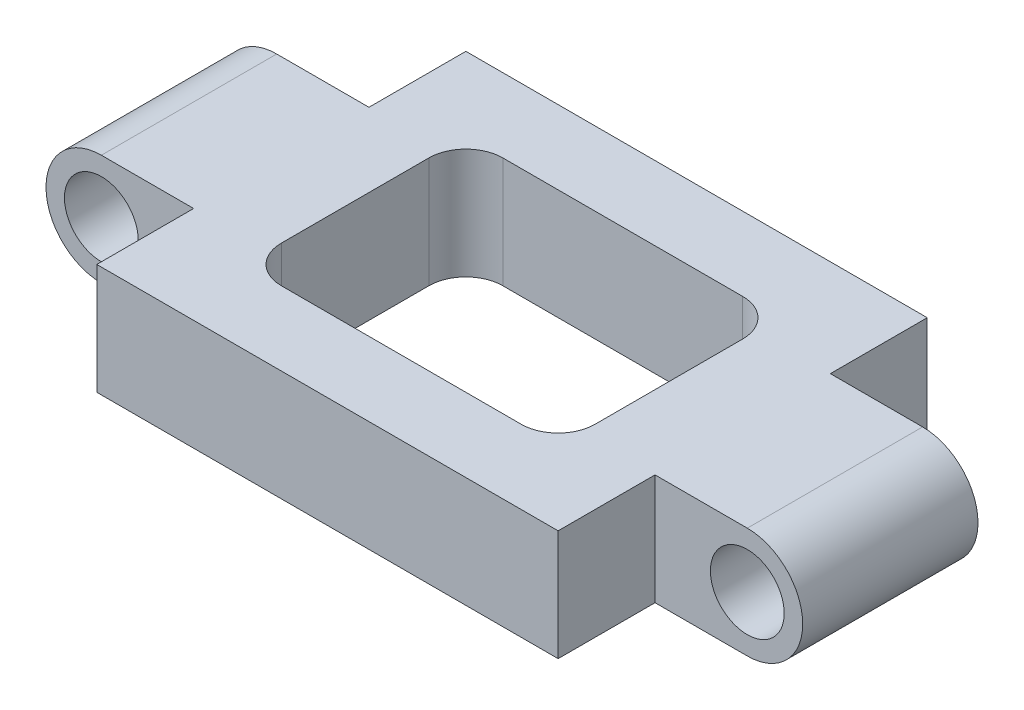
ISO-10303-21;
HEADER;
FILE_DESCRIPTION(('STEP AP214'),'2;1');
FILE_NAME('part.step','',(''),(''),'','','');
FILE_SCHEMA(('AUTOMOTIVE_DESIGN { 1 0 10303 214 1 1 1 1 }'));
ENDSEC;
DATA;
#1=APPLICATION_CONTEXT('core data for automotive mechanical design processes');
#2=APPLICATION_PROTOCOL_DEFINITION('international standard','automotive_design',2000,#1);
#3=PRODUCT_CONTEXT('',#1,'mechanical');
#4=PRODUCT('Part','Part','',(#3));
#5=PRODUCT_RELATED_PRODUCT_CATEGORY('part','',(#4));
#6=PRODUCT_DEFINITION_FORMATION('','',#4);
#7=PRODUCT_DEFINITION_CONTEXT('part definition',#1,'design');
#8=PRODUCT_DEFINITION('design','',#6,#7);
#9=PRODUCT_DEFINITION_SHAPE('','',#8);
#10=(LENGTH_UNIT() NAMED_UNIT(*) SI_UNIT(.MILLI.,.METRE.));
#11=(NAMED_UNIT(*) PLANE_ANGLE_UNIT() SI_UNIT($,.RADIAN.));
#12=(NAMED_UNIT(*) SI_UNIT($,.STERADIAN.) SOLID_ANGLE_UNIT());
#13=UNCERTAINTY_MEASURE_WITH_UNIT(LENGTH_MEASURE(1.E-05),#10,'distance_accuracy_value','');
#14=(GEOMETRIC_REPRESENTATION_CONTEXT(3) GLOBAL_UNCERTAINTY_ASSIGNED_CONTEXT((#13)) GLOBAL_UNIT_ASSIGNED_CONTEXT((#10,
#11,#12)) REPRESENTATION_CONTEXT('',''));
#15=CARTESIAN_POINT('',(0.,0.,0.));
#16=DIRECTION('',(0.,0.,1.));
#17=DIRECTION('',(1.,0.,0.));
#18=AXIS2_PLACEMENT_3D('',#15,#16,#17);
#19=CARTESIAN_POINT('',(17.5,0.,10.));
#20=DIRECTION('',(0.,0.,1.));
#21=DIRECTION('',(1.,0.,0.));
#22=AXIS2_PLACEMENT_3D('',#19,#20,#21);
#23=PLANE('',#22);
#24=DIRECTION('',(0.,1.,0.));
#25=VECTOR('',#24,1.);
#26=CARTESIAN_POINT('',(12.5,-12.5688296045023,10.));
#27=LINE('',#26,#25);
#28=CARTESIAN_POINT('',(12.5,-3.,10.));
#29=VERTEX_POINT('',#28);
#30=CARTESIAN_POINT('',(12.5,3.,10.));
#31=VERTEX_POINT('',#30);
#32=EDGE_CURVE('E190',#29,#31,#27,.T.);
#33=ORIENTED_EDGE('',*,*,#32,.T.);
#34=DIRECTION('',(-1.,0.,0.));
#35=VECTOR('',#34,1.);
#36=CARTESIAN_POINT('',(17.5,3.00000000000001,10.));
#37=LINE('',#36,#35);
#38=CARTESIAN_POINT('',(-12.5,3.,10.));
#39=VERTEX_POINT('',#38);
#40=EDGE_CURVE('E195',#31,#39,#37,.T.);
#41=ORIENTED_EDGE('',*,*,#40,.T.);
#42=DIRECTION('',(0.,1.,0.));
#43=VECTOR('',#42,1.);
#44=CARTESIAN_POINT('',(-12.5,-12.5688296045023,10.));
#45=LINE('',#44,#43);
#46=CARTESIAN_POINT('',(-12.5,-3.,10.));
#47=VERTEX_POINT('',#46);
#48=EDGE_CURVE('E253',#47,#39,#45,.T.);
#49=ORIENTED_EDGE('',*,*,#48,.F.);
#50=DIRECTION('',(1.,0.,0.));
#51=VECTOR('',#50,1.);
#52=CARTESIAN_POINT('',(17.5,-2.99999999999999,10.));
#53=LINE('',#52,#51);
#54=EDGE_CURVE('E263',#47,#29,#53,.T.);
#55=ORIENTED_EDGE('',*,*,#54,.T.);
#56=EDGE_LOOP('',(#33,#41,#49,#55));
#57=FACE_BOUND('',#56,.T.);
#58=ADVANCED_FACE('F34',(#57),#23,.T.);
#59=CARTESIAN_POINT('',(17.5,0.,-10.));
#60=DIRECTION('',(0.,0.,1.));
#61=DIRECTION('',(1.,0.,0.));
#62=AXIS2_PLACEMENT_3D('',#59,#60,#61);
#63=PLANE('',#62);
#64=DIRECTION('',(-1.,0.,0.));
#65=VECTOR('',#64,1.);
#66=CARTESIAN_POINT('',(17.5,3.00000000000001,-10.));
#67=LINE('',#66,#65);
#68=CARTESIAN_POINT('',(12.5,3.,-10.));
#69=VERTEX_POINT('',#68);
#70=CARTESIAN_POINT('',(-12.5,3.,-10.));
#71=VERTEX_POINT('',#70);
#72=EDGE_CURVE('E261',#69,#71,#67,.T.);
#73=ORIENTED_EDGE('',*,*,#72,.F.);
#74=DIRECTION('',(0.,1.,0.));
#75=VECTOR('',#74,1.);
#76=CARTESIAN_POINT('',(12.5,-12.5688296045023,-10.));
#77=LINE('',#76,#75);
#78=CARTESIAN_POINT('',(12.5,-2.99999999999999,-10.));
#79=VERTEX_POINT('',#78);
#80=EDGE_CURVE('E217',#79,#69,#77,.T.);
#81=ORIENTED_EDGE('',*,*,#80,.F.);
#82=DIRECTION('',(1.,0.,0.));
#83=VECTOR('',#82,1.);
#84=CARTESIAN_POINT('',(17.5,-2.99999999999999,-10.));
#85=LINE('',#84,#83);
#86=CARTESIAN_POINT('',(-12.5,-3.,-10.));
#87=VERTEX_POINT('',#86);
#88=EDGE_CURVE('E264',#87,#79,#85,.T.);
#89=ORIENTED_EDGE('',*,*,#88,.F.);
#90=DIRECTION('',(0.,1.,0.));
#91=VECTOR('',#90,1.);
#92=CARTESIAN_POINT('',(-12.5,-12.5688296045023,-10.));
#93=LINE('',#92,#91);
#94=EDGE_CURVE('E228',#87,#71,#93,.T.);
#95=ORIENTED_EDGE('',*,*,#94,.T.);
#96=EDGE_LOOP('',(#73,#81,#89,#95));
#97=FACE_BOUND('',#96,.T.);
#98=ADVANCED_FACE('F378',(#97),#63,.F.);
#99=CARTESIAN_POINT('',(17.5,0.,10.));
#100=DIRECTION('',(0.,0.,-1.));
#101=DIRECTION('',(-1.,0.,0.));
#102=AXIS2_PLACEMENT_3D('',#99,#100,#101);
#103=CYLINDRICAL_SURFACE('',#102,3.);
#104=DIRECTION('',(0.,0.,-1.));
#105=VECTOR('',#104,1.);
#106=CARTESIAN_POINT('',(17.5,3.00000000000001,10.));
#107=LINE('',#106,#105);
#108=CARTESIAN_POINT('',(17.5,3.00000000000001,4.75));
#109=VERTEX_POINT('',#108);
#110=CARTESIAN_POINT('',(17.5,3.00000000000001,-4.75));
#111=VERTEX_POINT('',#110);
#112=EDGE_CURVE('E278',#109,#111,#107,.T.);
#113=ORIENTED_EDGE('',*,*,#112,.F.);
#114=CARTESIAN_POINT('',(17.5,0.,4.75));
#115=DIRECTION('',(0.,0.,-1.));
#116=DIRECTION('',(-1.,0.,0.));
#117=AXIS2_PLACEMENT_3D('',#114,#115,#116);
#118=CIRCLE('',#117,3.);
#119=CARTESIAN_POINT('',(17.5,-2.99999999999999,4.75));
#120=VERTEX_POINT('',#119);
#121=EDGE_CURVE('E177',#109,#120,#118,.T.);
#122=ORIENTED_EDGE('',*,*,#121,.T.);
#123=DIRECTION('',(0.,0.,-1.));
#124=VECTOR('',#123,1.);
#125=CARTESIAN_POINT('',(17.5,-2.99999999999999,10.));
#126=LINE('',#125,#124);
#127=CARTESIAN_POINT('',(17.5,-2.99999999999999,-4.75));
#128=VERTEX_POINT('',#127);
#129=EDGE_CURVE('E267',#120,#128,#126,.T.);
#130=ORIENTED_EDGE('',*,*,#129,.T.);
#131=CARTESIAN_POINT('',(17.5,0.,-4.75));
#132=DIRECTION('',(0.,0.,1.));
#133=DIRECTION('',(1.,0.,0.));
#134=AXIS2_PLACEMENT_3D('',#131,#132,#133);
#135=CIRCLE('',#134,3.);
#136=EDGE_CURVE('E220',#128,#111,#135,.T.);
#137=ORIENTED_EDGE('',*,*,#136,.T.);
#138=EDGE_LOOP('',(#113,#122,#130,#137));
#139=FACE_BOUND('',#138,.T.);
#140=ADVANCED_FACE('F384',(#139),#103,.T.);
#141=CARTESIAN_POINT('',(17.5,3.00000000000001,10.));
#142=DIRECTION('',(0.,-1.,0.));
#143=DIRECTION('',(1.,0.,0.));
#144=AXIS2_PLACEMENT_3D('',#141,#142,#143);
#145=PLANE('',#144);
#146=DIRECTION('',(1.,0.,0.));
#147=VECTOR('',#146,1.);
#148=CARTESIAN_POINT('',(8.5,3.,6.));
#149=LINE('',#148,#147);
#150=CARTESIAN_POINT('',(-6.5,3.,6.));
#151=VERTEX_POINT('',#150);
#152=CARTESIAN_POINT('',(6.5,3.,6.));
#153=VERTEX_POINT('',#152);
#154=EDGE_CURVE('E356',#151,#153,#149,.T.);
#155=ORIENTED_EDGE('',*,*,#154,.F.);
#156=CARTESIAN_POINT('',(-6.5,3.,4.));
#157=DIRECTION('',(0.,-1.,0.));
#158=DIRECTION('',(1.,0.,0.));
#159=AXIS2_PLACEMENT_3D('',#156,#157,#158);
#160=CIRCLE('',#159,2.);
#161=CARTESIAN_POINT('',(-8.5,3.,4.));
#162=VERTEX_POINT('',#161);
#163=EDGE_CURVE('E317',#151,#162,#160,.T.);
#164=ORIENTED_EDGE('',*,*,#163,.T.);
#165=DIRECTION('',(0.,0.,1.));
#166=VECTOR('',#165,1.);
#167=CARTESIAN_POINT('',(-8.5,3.,-6.));
#168=LINE('',#167,#166);
#169=CARTESIAN_POINT('',(-8.5,3.,-4.));
#170=VERTEX_POINT('',#169);
#171=EDGE_CURVE('E332',#170,#162,#168,.T.);
#172=ORIENTED_EDGE('',*,*,#171,.F.);
#173=CARTESIAN_POINT('',(-6.5,3.,-4.));
#174=DIRECTION('',(0.,-1.,0.));
#175=DIRECTION('',(1.,0.,0.));
#176=AXIS2_PLACEMENT_3D('',#173,#174,#175);
#177=CIRCLE('',#176,2.);
#178=CARTESIAN_POINT('',(-6.5,3.,-6.));
#179=VERTEX_POINT('',#178);
#180=EDGE_CURVE('E42',#170,#179,#177,.T.);
#181=ORIENTED_EDGE('',*,*,#180,.T.);
#182=DIRECTION('',(-1.,0.,0.));
#183=VECTOR('',#182,1.);
#184=CARTESIAN_POINT('',(8.5,3.,-6.));
#185=LINE('',#184,#183);
#186=CARTESIAN_POINT('',(6.5,3.,-6.));
#187=VERTEX_POINT('',#186);
#188=EDGE_CURVE('E182',#187,#179,#185,.T.);
#189=ORIENTED_EDGE('',*,*,#188,.F.);
#190=CARTESIAN_POINT('',(6.5,3.,-4.));
#191=DIRECTION('',(0.,-1.,0.));
#192=DIRECTION('',(1.,0.,0.));
#193=AXIS2_PLACEMENT_3D('',#190,#191,#192);
#194=CIRCLE('',#193,2.);
#195=CARTESIAN_POINT('',(8.5,3.,-4.));
#196=VERTEX_POINT('',#195);
#197=EDGE_CURVE('E325',#187,#196,#194,.T.);
#198=ORIENTED_EDGE('',*,*,#197,.T.);
#199=DIRECTION('',(0.,0.,-1.));
#200=VECTOR('',#199,1.);
#201=CARTESIAN_POINT('',(8.5,3.,-6.));
#202=LINE('',#201,#200);
#203=CARTESIAN_POINT('',(8.5,3.,4.));
#204=VERTEX_POINT('',#203);
#205=EDGE_CURVE('E337',#204,#196,#202,.T.);
#206=ORIENTED_EDGE('',*,*,#205,.F.);
#207=CARTESIAN_POINT('',(6.5,3.,4.));
#208=DIRECTION('',(0.,-1.,0.));
#209=DIRECTION('',(1.,0.,0.));
#210=AXIS2_PLACEMENT_3D('',#207,#208,#209);
#211=CIRCLE('',#210,2.);
#212=EDGE_CURVE('E321',#204,#153,#211,.T.);
#213=ORIENTED_EDGE('',*,*,#212,.T.);
#214=EDGE_LOOP('',(#155,#164,#172,#181,#189,#198,#206,#213));
#215=FACE_BOUND('',#214,.T.);
#216=ORIENTED_EDGE('',*,*,#40,.F.);
#217=DIRECTION('',(0.,0.,1.));
#218=VECTOR('',#217,1.);
#219=CARTESIAN_POINT('',(12.5,3.,10.));
#220=LINE('',#219,#218);
#221=CARTESIAN_POINT('',(12.5,3.,4.75));
#222=VERTEX_POINT('',#221);
#223=EDGE_CURVE('E181',#222,#31,#220,.T.);
#224=ORIENTED_EDGE('',*,*,#223,.F.);
#225=DIRECTION('',(-1.,0.,0.));
#226=VECTOR('',#225,1.);
#227=CARTESIAN_POINT('',(20.5,3.00000000000001,4.75));
#228=LINE('',#227,#226);
#229=EDGE_CURVE('E171',#109,#222,#228,.T.);
#230=ORIENTED_EDGE('',*,*,#229,.F.);
#231=ORIENTED_EDGE('',*,*,#112,.T.);
#232=DIRECTION('',(1.,0.,0.));
#233=VECTOR('',#232,1.);
#234=CARTESIAN_POINT('',(20.5,3.00000000000001,-4.75));
#235=LINE('',#234,#233);
#236=CARTESIAN_POINT('',(12.5,3.,-4.75));
#237=VERTEX_POINT('',#236);
#238=EDGE_CURVE('E214',#237,#111,#235,.T.);
#239=ORIENTED_EDGE('',*,*,#238,.F.);
#240=DIRECTION('',(0.,0.,1.));
#241=VECTOR('',#240,1.);
#242=CARTESIAN_POINT('',(12.5,3.,-4.75));
#243=LINE('',#242,#241);
#244=EDGE_CURVE('E204',#69,#237,#243,.T.);
#245=ORIENTED_EDGE('',*,*,#244,.F.);
#246=ORIENTED_EDGE('',*,*,#72,.T.);
#247=DIRECTION('',(0.,0.,-1.));
#248=VECTOR('',#247,1.);
#249=CARTESIAN_POINT('',(-12.5,3.,-4.75));
#250=LINE('',#249,#248);
#251=CARTESIAN_POINT('',(-12.5,3.,-4.75));
#252=VERTEX_POINT('',#251);
#253=EDGE_CURVE('E230',#252,#71,#250,.T.);
#254=ORIENTED_EDGE('',*,*,#253,.F.);
#255=DIRECTION('',(1.,0.,0.));
#256=VECTOR('',#255,1.);
#257=CARTESIAN_POINT('',(-20.5,2.99999999999999,-4.75));
#258=LINE('',#257,#256);
#259=CARTESIAN_POINT('',(-17.5,2.99999999999999,-4.75));
#260=VERTEX_POINT('',#259);
#261=EDGE_CURVE('E223',#260,#252,#258,.T.);
#262=ORIENTED_EDGE('',*,*,#261,.F.);
#263=DIRECTION('',(0.,0.,-1.));
#264=VECTOR('',#263,1.);
#265=CARTESIAN_POINT('',(-17.5,2.99999999999999,10.));
#266=LINE('',#265,#264);
#267=CARTESIAN_POINT('',(-17.5,2.99999999999999,4.75));
#268=VERTEX_POINT('',#267);
#269=EDGE_CURVE('E275',#268,#260,#266,.T.);
#270=ORIENTED_EDGE('',*,*,#269,.F.);
#271=DIRECTION('',(-1.,0.,0.));
#272=VECTOR('',#271,1.);
#273=CARTESIAN_POINT('',(-20.5,2.99999999999999,4.75));
#274=LINE('',#273,#272);
#275=CARTESIAN_POINT('',(-12.5,3.,4.75));
#276=VERTEX_POINT('',#275);
#277=EDGE_CURVE('E250',#276,#268,#274,.T.);
#278=ORIENTED_EDGE('',*,*,#277,.F.);
#279=DIRECTION('',(0.,0.,-1.));
#280=VECTOR('',#279,1.);
#281=CARTESIAN_POINT('',(-12.5,3.,10.));
#282=LINE('',#281,#280);
#283=EDGE_CURVE('E242',#39,#276,#282,.T.);
#284=ORIENTED_EDGE('',*,*,#283,.F.);
#285=EDGE_LOOP('',(#216,#224,#230,#231,#239,#245,#246,#254,#262,#270,#278,#284));
#286=FACE_BOUND('',#285,.T.);
#287=ADVANCED_FACE('F193',(#215,#286),#145,.F.);
#288=CARTESIAN_POINT('',(-17.5,0.,10.));
#289=DIRECTION('',(0.,0.,-1.));
#290=DIRECTION('',(-1.,0.,0.));
#291=AXIS2_PLACEMENT_3D('',#288,#289,#290);
#292=CYLINDRICAL_SURFACE('',#291,3.);
#293=ORIENTED_EDGE('',*,*,#269,.T.);
#294=CARTESIAN_POINT('',(-17.5,0.,-4.75));
#295=DIRECTION('',(0.,0.,1.));
#296=DIRECTION('',(1.,0.,0.));
#297=AXIS2_PLACEMENT_3D('',#294,#295,#296);
#298=CIRCLE('',#297,3.);
#299=CARTESIAN_POINT('',(-17.5,-3.00000000000001,-4.75));
#300=VERTEX_POINT('',#299);
#301=EDGE_CURVE('E240',#260,#300,#298,.T.);
#302=ORIENTED_EDGE('',*,*,#301,.T.);
#303=DIRECTION('',(0.,0.,-1.));
#304=VECTOR('',#303,1.);
#305=CARTESIAN_POINT('',(-17.5,-3.,10.));
#306=LINE('',#305,#304);
#307=CARTESIAN_POINT('',(-17.5,-3.00000000000001,4.75));
#308=VERTEX_POINT('',#307);
#309=EDGE_CURVE('E272',#308,#300,#306,.T.);
#310=ORIENTED_EDGE('',*,*,#309,.F.);
#311=CARTESIAN_POINT('',(-17.5,0.,4.75));
#312=DIRECTION('',(0.,0.,-1.));
#313=DIRECTION('',(-1.,0.,0.));
#314=AXIS2_PLACEMENT_3D('',#311,#312,#313);
#315=CIRCLE('',#314,3.);
#316=EDGE_CURVE('E259',#308,#268,#315,.T.);
#317=ORIENTED_EDGE('',*,*,#316,.T.);
#318=EDGE_LOOP('',(#293,#302,#310,#317));
#319=FACE_BOUND('',#318,.T.);
#320=ADVANCED_FACE('F393',(#319),#292,.T.);
#321=CARTESIAN_POINT('',(17.5,-2.99999999999999,10.));
#322=DIRECTION('',(0.,1.,0.));
#323=DIRECTION('',(-1.,0.,0.));
#324=AXIS2_PLACEMENT_3D('',#321,#322,#323);
#325=PLANE('',#324);
#326=DIRECTION('',(0.,0.,-1.));
#327=VECTOR('',#326,1.);
#328=CARTESIAN_POINT('',(8.5,-3.,10.));
#329=LINE('',#328,#327);
#330=CARTESIAN_POINT('',(8.5,-3.,4.));
#331=VERTEX_POINT('',#330);
#332=CARTESIAN_POINT('',(8.5,-3.,-4.));
#333=VERTEX_POINT('',#332);
#334=EDGE_CURVE('E291',#331,#333,#329,.T.);
#335=ORIENTED_EDGE('',*,*,#334,.T.);
#336=CARTESIAN_POINT('',(6.5,-3.,-4.));
#337=DIRECTION('',(0.,1.,0.));
#338=DIRECTION('',(-1.,0.,0.));
#339=AXIS2_PLACEMENT_3D('',#336,#337,#338);
#340=CIRCLE('',#339,2.);
#341=CARTESIAN_POINT('',(6.5,-3.,-6.));
#342=VERTEX_POINT('',#341);
#343=EDGE_CURVE('E56',#333,#342,#340,.T.);
#344=ORIENTED_EDGE('',*,*,#343,.T.);
#345=DIRECTION('',(-1.,0.,0.));
#346=VECTOR('',#345,1.);
#347=CARTESIAN_POINT('',(17.5,-2.99999999999999,-6.));
#348=LINE('',#347,#346);
#349=CARTESIAN_POINT('',(-6.5,-3.,-6.));
#350=VERTEX_POINT('',#349);
#351=EDGE_CURVE('E293',#342,#350,#348,.T.);
#352=ORIENTED_EDGE('',*,*,#351,.T.);
#353=CARTESIAN_POINT('',(-6.5,-3.,-4.));
#354=DIRECTION('',(0.,1.,0.));
#355=DIRECTION('',(-1.,0.,0.));
#356=AXIS2_PLACEMENT_3D('',#353,#354,#355);
#357=CIRCLE('',#356,2.);
#358=CARTESIAN_POINT('',(-8.5,-3.,-4.));
#359=VERTEX_POINT('',#358);
#360=EDGE_CURVE('E11',#350,#359,#357,.T.);
#361=ORIENTED_EDGE('',*,*,#360,.T.);
#362=DIRECTION('',(0.,0.,1.));
#363=VECTOR('',#362,1.);
#364=CARTESIAN_POINT('',(-8.5,-3.,10.));
#365=LINE('',#364,#363);
#366=CARTESIAN_POINT('',(-8.5,-3.,4.));
#367=VERTEX_POINT('',#366);
#368=EDGE_CURVE('E295',#359,#367,#365,.T.);
#369=ORIENTED_EDGE('',*,*,#368,.T.);
#370=CARTESIAN_POINT('',(-6.5,-3.,4.));
#371=DIRECTION('',(0.,1.,0.));
#372=DIRECTION('',(-1.,0.,0.));
#373=AXIS2_PLACEMENT_3D('',#370,#371,#372);
#374=CIRCLE('',#373,2.);
#375=CARTESIAN_POINT('',(-6.5,-3.,6.));
#376=VERTEX_POINT('',#375);
#377=EDGE_CURVE('E319',#367,#376,#374,.T.);
#378=ORIENTED_EDGE('',*,*,#377,.T.);
#379=DIRECTION('',(1.,0.,0.));
#380=VECTOR('',#379,1.);
#381=CARTESIAN_POINT('',(17.5,-2.99999999999999,6.));
#382=LINE('',#381,#380);
#383=CARTESIAN_POINT('',(6.5,-3.,6.));
#384=VERTEX_POINT('',#383);
#385=EDGE_CURVE('E280',#376,#384,#382,.T.);
#386=ORIENTED_EDGE('',*,*,#385,.T.);
#387=CARTESIAN_POINT('',(6.5,-3.,4.));
#388=DIRECTION('',(0.,1.,0.));
#389=DIRECTION('',(-1.,0.,0.));
#390=AXIS2_PLACEMENT_3D('',#387,#388,#389);
#391=CIRCLE('',#390,2.);
#392=EDGE_CURVE('E323',#384,#331,#391,.T.);
#393=ORIENTED_EDGE('',*,*,#392,.T.);
#394=EDGE_LOOP('',(#335,#344,#352,#361,#369,#378,#386,#393));
#395=FACE_BOUND('',#394,.T.);
#396=DIRECTION('',(1.,0.,0.));
#397=VECTOR('',#396,1.);
#398=CARTESIAN_POINT('',(20.5,-2.99999999999999,4.75));
#399=LINE('',#398,#397);
#400=CARTESIAN_POINT('',(12.5,-3.,4.75));
#401=VERTEX_POINT('',#400);
#402=EDGE_CURVE('E200',#401,#120,#399,.T.);
#403=ORIENTED_EDGE('',*,*,#402,.F.);
#404=DIRECTION('',(0.,0.,-1.));
#405=VECTOR('',#404,1.);
#406=CARTESIAN_POINT('',(12.5,-3.,10.));
#407=LINE('',#406,#405);
#408=EDGE_CURVE('E188',#29,#401,#407,.T.);
#409=ORIENTED_EDGE('',*,*,#408,.F.);
#410=ORIENTED_EDGE('',*,*,#54,.F.);
#411=DIRECTION('',(0.,0.,1.));
#412=VECTOR('',#411,1.);
#413=CARTESIAN_POINT('',(-12.5,-3.,10.));
#414=LINE('',#413,#412);
#415=CARTESIAN_POINT('',(-12.5,-3.,4.75));
#416=VERTEX_POINT('',#415);
#417=EDGE_CURVE('E246',#416,#47,#414,.T.);
#418=ORIENTED_EDGE('',*,*,#417,.F.);
#419=DIRECTION('',(1.,0.,0.));
#420=VECTOR('',#419,1.);
#421=CARTESIAN_POINT('',(-20.5,-3.00000000000001,4.75));
#422=LINE('',#421,#420);
#423=EDGE_CURVE('E243',#308,#416,#422,.T.);
#424=ORIENTED_EDGE('',*,*,#423,.F.);
#425=ORIENTED_EDGE('',*,*,#309,.T.);
#426=DIRECTION('',(-1.,0.,0.));
#427=VECTOR('',#426,1.);
#428=CARTESIAN_POINT('',(-20.5,-3.00000000000001,-4.75));
#429=LINE('',#428,#427);
#430=CARTESIAN_POINT('',(-12.5,-3.,-4.75));
#431=VERTEX_POINT('',#430);
#432=EDGE_CURVE('E224',#431,#300,#429,.T.);
#433=ORIENTED_EDGE('',*,*,#432,.F.);
#434=DIRECTION('',(0.,0.,1.));
#435=VECTOR('',#434,1.);
#436=CARTESIAN_POINT('',(-12.5,-3.,-4.75));
#437=LINE('',#436,#435);
#438=EDGE_CURVE('E227',#87,#431,#437,.T.);
#439=ORIENTED_EDGE('',*,*,#438,.F.);
#440=ORIENTED_EDGE('',*,*,#88,.T.);
#441=DIRECTION('',(0.,0.,-1.));
#442=VECTOR('',#441,1.);
#443=CARTESIAN_POINT('',(12.5,-3.,-4.75));
#444=LINE('',#443,#442);
#445=CARTESIAN_POINT('',(12.5,-3.,-4.75));
#446=VERTEX_POINT('',#445);
#447=EDGE_CURVE('E205',#446,#79,#444,.T.);
#448=ORIENTED_EDGE('',*,*,#447,.F.);
#449=DIRECTION('',(-1.,0.,0.));
#450=VECTOR('',#449,1.);
#451=CARTESIAN_POINT('',(20.5,-2.99999999999999,-4.75));
#452=LINE('',#451,#450);
#453=EDGE_CURVE('E207',#128,#446,#452,.T.);
#454=ORIENTED_EDGE('',*,*,#453,.F.);
#455=ORIENTED_EDGE('',*,*,#129,.F.);
#456=EDGE_LOOP('',(#403,#409,#410,#418,#424,#425,#433,#439,#440,#448,#454,#455));
#457=FACE_BOUND('',#456,.T.);
#458=ADVANCED_FACE('F341',(#395,#457),#325,.F.);
#459=CARTESIAN_POINT('',(17.5,0.,10.));
#460=DIRECTION('',(0.,0.,-1.));
#461=DIRECTION('',(-1.,0.,0.));
#462=AXIS2_PLACEMENT_3D('',#459,#460,#461);
#463=CYLINDRICAL_SURFACE('',#462,2.);
#464=CARTESIAN_POINT('',(17.5,0.,4.75));
#465=DIRECTION('',(0.,0.,-1.));
#466=DIRECTION('',(-1.,0.,0.));
#467=AXIS2_PLACEMENT_3D('',#464,#465,#466);
#468=CIRCLE('',#467,2.);
#469=CARTESIAN_POINT('',(15.5,0.,4.75));
#470=VERTEX_POINT('',#469);
#471=EDGE_CURVE('E202',#470,#470,#468,.T.);
#472=ORIENTED_EDGE('',*,*,#471,.F.);
#473=EDGE_LOOP('',(#472));
#474=FACE_BOUND('',#473,.T.);
#475=CARTESIAN_POINT('',(17.5,0.,-4.75));
#476=DIRECTION('',(0.,0.,1.));
#477=DIRECTION('',(1.,0.,0.));
#478=AXIS2_PLACEMENT_3D('',#475,#476,#477);
#479=CIRCLE('',#478,2.);
#480=CARTESIAN_POINT('',(19.5,0.,-4.75));
#481=VERTEX_POINT('',#480);
#482=EDGE_CURVE('E211',#481,#481,#479,.T.);
#483=ORIENTED_EDGE('',*,*,#482,.F.);
#484=EDGE_LOOP('',(#483));
#485=FACE_BOUND('',#484,.T.);
#486=ADVANCED_FACE('F388',(#474,#485),#463,.F.);
#487=CARTESIAN_POINT('',(-17.5,0.,10.));
#488=DIRECTION('',(0.,0.,-1.));
#489=DIRECTION('',(-1.,0.,0.));
#490=AXIS2_PLACEMENT_3D('',#487,#488,#489);
#491=CYLINDRICAL_SURFACE('',#490,2.);
#492=CARTESIAN_POINT('',(-17.5,0.,-4.75));
#493=DIRECTION('',(0.,0.,1.));
#494=DIRECTION('',(1.,0.,0.));
#495=AXIS2_PLACEMENT_3D('',#492,#493,#494);
#496=CIRCLE('',#495,2.);
#497=CARTESIAN_POINT('',(-15.5,0.,-4.75));
#498=VERTEX_POINT('',#497);
#499=EDGE_CURVE('E239',#498,#498,#496,.T.);
#500=ORIENTED_EDGE('',*,*,#499,.F.);
#501=EDGE_LOOP('',(#500));
#502=FACE_BOUND('',#501,.T.);
#503=CARTESIAN_POINT('',(-17.5,0.,4.75));
#504=DIRECTION('',(0.,0.,-1.));
#505=DIRECTION('',(-1.,0.,0.));
#506=AXIS2_PLACEMENT_3D('',#503,#504,#505);
#507=CIRCLE('',#506,2.);
#508=CARTESIAN_POINT('',(-19.5,0.,4.75));
#509=VERTEX_POINT('',#508);
#510=EDGE_CURVE('E258',#509,#509,#507,.T.);
#511=ORIENTED_EDGE('',*,*,#510,.F.);
#512=EDGE_LOOP('',(#511));
#513=FACE_BOUND('',#512,.T.);
#514=ADVANCED_FACE('F440',(#502,#513),#491,.F.);
#515=CARTESIAN_POINT('',(-20.5,-12.5688296045023,4.75));
#516=DIRECTION('',(0.,0.,-1.));
#517=DIRECTION('',(-1.,0.,0.));
#518=AXIS2_PLACEMENT_3D('',#515,#516,#517);
#519=PLANE('',#518);
#520=ORIENTED_EDGE('',*,*,#510,.T.);
#521=EDGE_LOOP('',(#520));
#522=FACE_BOUND('',#521,.T.);
#523=ORIENTED_EDGE('',*,*,#316,.F.);
#524=ORIENTED_EDGE('',*,*,#423,.T.);
#525=DIRECTION('',(0.,1.,0.));
#526=VECTOR('',#525,1.);
#527=CARTESIAN_POINT('',(-12.5,-12.5688296045023,4.75));
#528=LINE('',#527,#526);
#529=EDGE_CURVE('E247',#416,#276,#528,.T.);
#530=ORIENTED_EDGE('',*,*,#529,.T.);
#531=ORIENTED_EDGE('',*,*,#277,.T.);
#532=EDGE_LOOP('',(#523,#524,#530,#531));
#533=FACE_BOUND('',#532,.T.);
#534=ADVANCED_FACE('F437',(#522,#533),#519,.F.);
#535=CARTESIAN_POINT('',(-12.5,-12.5688296045023,10.));
#536=DIRECTION('',(1.,0.,0.));
#537=DIRECTION('',(0.,1.,0.));
#538=AXIS2_PLACEMENT_3D('',#535,#536,#537);
#539=PLANE('',#538);
#540=ORIENTED_EDGE('',*,*,#417,.T.);
#541=ORIENTED_EDGE('',*,*,#48,.T.);
#542=ORIENTED_EDGE('',*,*,#283,.T.);
#543=ORIENTED_EDGE('',*,*,#529,.F.);
#544=EDGE_LOOP('',(#540,#541,#542,#543));
#545=FACE_BOUND('',#544,.T.);
#546=ADVANCED_FACE('F435',(#545),#539,.F.);
#547=CARTESIAN_POINT('',(-20.5,-12.5688296045023,-4.75));
#548=DIRECTION('',(0.,0.,1.));
#549=DIRECTION('',(1.,0.,0.));
#550=AXIS2_PLACEMENT_3D('',#547,#548,#549);
#551=PLANE('',#550);
#552=ORIENTED_EDGE('',*,*,#499,.T.);
#553=EDGE_LOOP('',(#552));
#554=FACE_BOUND('',#553,.T.);
#555=ORIENTED_EDGE('',*,*,#261,.T.);
#556=DIRECTION('',(0.,1.,0.));
#557=VECTOR('',#556,1.);
#558=CARTESIAN_POINT('',(-12.5,-12.5688296045023,-4.75));
#559=LINE('',#558,#557);
#560=EDGE_CURVE('E233',#431,#252,#559,.T.);
#561=ORIENTED_EDGE('',*,*,#560,.F.);
#562=ORIENTED_EDGE('',*,*,#432,.T.);
#563=ORIENTED_EDGE('',*,*,#301,.F.);
#564=EDGE_LOOP('',(#555,#561,#562,#563));
#565=FACE_BOUND('',#564,.T.);
#566=ADVANCED_FACE('F431',(#554,#565),#551,.F.);
#567=CARTESIAN_POINT('',(-12.5,-12.5688296045023,-4.75));
#568=DIRECTION('',(1.,0.,0.));
#569=DIRECTION('',(0.,1.,0.));
#570=AXIS2_PLACEMENT_3D('',#567,#568,#569);
#571=PLANE('',#570);
#572=ORIENTED_EDGE('',*,*,#438,.T.);
#573=ORIENTED_EDGE('',*,*,#560,.T.);
#574=ORIENTED_EDGE('',*,*,#253,.T.);
#575=ORIENTED_EDGE('',*,*,#94,.F.);
#576=EDGE_LOOP('',(#572,#573,#574,#575));
#577=FACE_BOUND('',#576,.T.);
#578=ADVANCED_FACE('F424',(#577),#571,.F.);
#579=CARTESIAN_POINT('',(20.5,-12.5688296045023,-4.75));
#580=DIRECTION('',(0.,0.,1.));
#581=DIRECTION('',(1.,0.,0.));
#582=AXIS2_PLACEMENT_3D('',#579,#580,#581);
#583=PLANE('',#582);
#584=ORIENTED_EDGE('',*,*,#482,.T.);
#585=EDGE_LOOP('',(#584));
#586=FACE_BOUND('',#585,.T.);
#587=ORIENTED_EDGE('',*,*,#136,.F.);
#588=ORIENTED_EDGE('',*,*,#453,.T.);
#589=DIRECTION('',(0.,1.,0.));
#590=VECTOR('',#589,1.);
#591=CARTESIAN_POINT('',(12.5,-12.5688296045023,-4.75));
#592=LINE('',#591,#590);
#593=EDGE_CURVE('E208',#446,#237,#592,.T.);
#594=ORIENTED_EDGE('',*,*,#593,.T.);
#595=ORIENTED_EDGE('',*,*,#238,.T.);
#596=EDGE_LOOP('',(#587,#588,#594,#595));
#597=FACE_BOUND('',#596,.T.);
#598=ADVANCED_FACE('F421',(#586,#597),#583,.F.);
#599=CARTESIAN_POINT('',(12.5,-12.5688296045023,-4.75));
#600=DIRECTION('',(-1.,0.,0.));
#601=DIRECTION('',(0.,-1.,0.));
#602=AXIS2_PLACEMENT_3D('',#599,#600,#601);
#603=PLANE('',#602);
#604=ORIENTED_EDGE('',*,*,#447,.T.);
#605=ORIENTED_EDGE('',*,*,#80,.T.);
#606=ORIENTED_EDGE('',*,*,#244,.T.);
#607=ORIENTED_EDGE('',*,*,#593,.F.);
#608=EDGE_LOOP('',(#604,#605,#606,#607));
#609=FACE_BOUND('',#608,.T.);
#610=ADVANCED_FACE('F419',(#609),#603,.F.);
#611=CARTESIAN_POINT('',(20.5,-12.5688296045023,4.75));
#612=DIRECTION('',(0.,0.,-1.));
#613=DIRECTION('',(-1.,0.,0.));
#614=AXIS2_PLACEMENT_3D('',#611,#612,#613);
#615=PLANE('',#614);
#616=ORIENTED_EDGE('',*,*,#471,.T.);
#617=EDGE_LOOP('',(#616));
#618=FACE_BOUND('',#617,.T.);
#619=ORIENTED_EDGE('',*,*,#229,.T.);
#620=DIRECTION('',(0.,1.,0.));
#621=VECTOR('',#620,1.);
#622=CARTESIAN_POINT('',(12.5,-12.5688296045023,4.75));
#623=LINE('',#622,#621);
#624=EDGE_CURVE('E175',#401,#222,#623,.T.);
#625=ORIENTED_EDGE('',*,*,#624,.F.);
#626=ORIENTED_EDGE('',*,*,#402,.T.);
#627=ORIENTED_EDGE('',*,*,#121,.F.);
#628=EDGE_LOOP('',(#619,#625,#626,#627));
#629=FACE_BOUND('',#628,.T.);
#630=ADVANCED_FACE('F173',(#618,#629),#615,.F.);
#631=CARTESIAN_POINT('',(12.5,-12.5688296045023,10.));
#632=DIRECTION('',(-1.,0.,0.));
#633=DIRECTION('',(0.,-1.,0.));
#634=AXIS2_PLACEMENT_3D('',#631,#632,#633);
#635=PLANE('',#634);
#636=ORIENTED_EDGE('',*,*,#408,.T.);
#637=ORIENTED_EDGE('',*,*,#624,.T.);
#638=ORIENTED_EDGE('',*,*,#223,.T.);
#639=ORIENTED_EDGE('',*,*,#32,.F.);
#640=EDGE_LOOP('',(#636,#637,#638,#639));
#641=FACE_BOUND('',#640,.T.);
#642=ADVANCED_FACE('F185',(#641),#635,.F.);
#643=CARTESIAN_POINT('',(-8.5,-7.,-6.));
#644=DIRECTION('',(-1.,0.,0.));
#645=DIRECTION('',(0.,-1.,0.));
#646=AXIS2_PLACEMENT_3D('',#643,#644,#645);
#647=PLANE('',#646);
#648=ORIENTED_EDGE('',*,*,#171,.T.);
#649=DIRECTION('',(0.,1.,0.));
#650=VECTOR('',#649,1.);
#651=CARTESIAN_POINT('',(-8.5,-3.,4.));
#652=LINE('',#651,#650);
#653=EDGE_CURVE('E306',#162,#367,#652,.F.);
#654=ORIENTED_EDGE('',*,*,#653,.T.);
#655=ORIENTED_EDGE('',*,*,#368,.F.);
#656=DIRECTION('',(0.,1.,0.));
#657=VECTOR('',#656,1.);
#658=CARTESIAN_POINT('',(-8.5,3.,-4.));
#659=LINE('',#658,#657);
#660=EDGE_CURVE('E303',#359,#170,#659,.T.);
#661=ORIENTED_EDGE('',*,*,#660,.T.);
#662=EDGE_LOOP('',(#648,#654,#655,#661));
#663=FACE_BOUND('',#662,.T.);
#664=ADVANCED_FACE('F345',(#663),#647,.F.);
#665=CARTESIAN_POINT('',(8.5,-7.,-6.));
#666=DIRECTION('',(0.,0.,-1.));
#667=DIRECTION('',(-1.,0.,0.));
#668=AXIS2_PLACEMENT_3D('',#665,#666,#667);
#669=PLANE('',#668);
#670=ORIENTED_EDGE('',*,*,#351,.F.);
#671=DIRECTION('',(0.,1.,0.));
#672=VECTOR('',#671,1.);
#673=CARTESIAN_POINT('',(6.5,3.,-6.));
#674=LINE('',#673,#672);
#675=EDGE_CURVE('E314',#342,#187,#674,.T.);
#676=ORIENTED_EDGE('',*,*,#675,.T.);
#677=ORIENTED_EDGE('',*,*,#188,.T.);
#678=DIRECTION('',(0.,1.,0.));
#679=VECTOR('',#678,1.);
#680=CARTESIAN_POINT('',(-6.5,-3.,-6.));
#681=LINE('',#680,#679);
#682=EDGE_CURVE('E49',#179,#350,#681,.F.);
#683=ORIENTED_EDGE('',*,*,#682,.T.);
#684=EDGE_LOOP('',(#670,#676,#677,#683));
#685=FACE_BOUND('',#684,.T.);
#686=ADVANCED_FACE('F335',(#685),#669,.F.);
#687=CARTESIAN_POINT('',(8.5,-7.,-6.));
#688=DIRECTION('',(1.,0.,0.));
#689=DIRECTION('',(0.,1.,0.));
#690=AXIS2_PLACEMENT_3D('',#687,#688,#689);
#691=PLANE('',#690);
#692=ORIENTED_EDGE('',*,*,#334,.F.);
#693=DIRECTION('',(0.,1.,0.));
#694=VECTOR('',#693,1.);
#695=CARTESIAN_POINT('',(8.5,3.,4.));
#696=LINE('',#695,#694);
#697=EDGE_CURVE('E310',#331,#204,#696,.T.);
#698=ORIENTED_EDGE('',*,*,#697,.T.);
#699=ORIENTED_EDGE('',*,*,#205,.T.);
#700=DIRECTION('',(0.,1.,0.));
#701=VECTOR('',#700,1.);
#702=CARTESIAN_POINT('',(8.5,-3.,-4.));
#703=LINE('',#702,#701);
#704=EDGE_CURVE('E308',#196,#333,#703,.F.);
#705=ORIENTED_EDGE('',*,*,#704,.T.);
#706=EDGE_LOOP('',(#692,#698,#699,#705));
#707=FACE_BOUND('',#706,.T.);
#708=ADVANCED_FACE('F362',(#707),#691,.F.);
#709=CARTESIAN_POINT('',(8.5,-7.,6.));
#710=DIRECTION('',(0.,0.,1.));
#711=DIRECTION('',(1.,0.,0.));
#712=AXIS2_PLACEMENT_3D('',#709,#710,#711);
#713=PLANE('',#712);
#714=ORIENTED_EDGE('',*,*,#385,.F.);
#715=DIRECTION('',(0.,1.,0.));
#716=VECTOR('',#715,1.);
#717=CARTESIAN_POINT('',(-6.5,3.,6.));
#718=LINE('',#717,#716);
#719=EDGE_CURVE('E300',#376,#151,#718,.T.);
#720=ORIENTED_EDGE('',*,*,#719,.T.);
#721=ORIENTED_EDGE('',*,*,#154,.T.);
#722=DIRECTION('',(0.,1.,0.));
#723=VECTOR('',#722,1.);
#724=CARTESIAN_POINT('',(6.5,-3.,6.));
#725=LINE('',#724,#723);
#726=EDGE_CURVE('E298',#153,#384,#725,.F.);
#727=ORIENTED_EDGE('',*,*,#726,.T.);
#728=EDGE_LOOP('',(#714,#720,#721,#727));
#729=FACE_BOUND('',#728,.T.);
#730=ADVANCED_FACE('F353',(#729),#713,.F.);
#731=CARTESIAN_POINT('',(-6.5,-7.,4.));
#732=DIRECTION('',(0.,-1.,0.));
#733=DIRECTION('',(1.,0.,0.));
#734=AXIS2_PLACEMENT_3D('',#731,#732,#733);
#735=CYLINDRICAL_SURFACE('',#734,2.);
#736=ORIENTED_EDGE('',*,*,#377,.F.);
#737=ORIENTED_EDGE('',*,*,#653,.F.);
#738=ORIENTED_EDGE('',*,*,#163,.F.);
#739=ORIENTED_EDGE('',*,*,#719,.F.);
#740=EDGE_LOOP('',(#736,#737,#738,#739));
#741=FACE_BOUND('',#740,.T.);
#742=ADVANCED_FACE('F348',(#741),#735,.F.);
#743=CARTESIAN_POINT('',(6.5,-7.,4.));
#744=DIRECTION('',(0.,-1.,0.));
#745=DIRECTION('',(1.,0.,0.));
#746=AXIS2_PLACEMENT_3D('',#743,#744,#745);
#747=CYLINDRICAL_SURFACE('',#746,2.);
#748=ORIENTED_EDGE('',*,*,#392,.F.);
#749=ORIENTED_EDGE('',*,*,#726,.F.);
#750=ORIENTED_EDGE('',*,*,#212,.F.);
#751=ORIENTED_EDGE('',*,*,#697,.F.);
#752=EDGE_LOOP('',(#748,#749,#750,#751));
#753=FACE_BOUND('',#752,.T.);
#754=ADVANCED_FACE('F358',(#753),#747,.F.);
#755=CARTESIAN_POINT('',(6.5,-7.,-4.));
#756=DIRECTION('',(0.,-1.,0.));
#757=DIRECTION('',(1.,0.,0.));
#758=AXIS2_PLACEMENT_3D('',#755,#756,#757);
#759=CYLINDRICAL_SURFACE('',#758,2.);
#760=ORIENTED_EDGE('',*,*,#343,.F.);
#761=ORIENTED_EDGE('',*,*,#704,.F.);
#762=ORIENTED_EDGE('',*,*,#197,.F.);
#763=ORIENTED_EDGE('',*,*,#675,.F.);
#764=EDGE_LOOP('',(#760,#761,#762,#763));
#765=FACE_BOUND('',#764,.T.);
#766=ADVANCED_FACE('F367',(#765),#759,.F.);
#767=CARTESIAN_POINT('',(-6.5,-7.,-4.));
#768=DIRECTION('',(0.,-1.,0.));
#769=DIRECTION('',(1.,0.,0.));
#770=AXIS2_PLACEMENT_3D('',#767,#768,#769);
#771=CYLINDRICAL_SURFACE('',#770,2.);
#772=ORIENTED_EDGE('',*,*,#360,.F.);
#773=ORIENTED_EDGE('',*,*,#682,.F.);
#774=ORIENTED_EDGE('',*,*,#180,.F.);
#775=ORIENTED_EDGE('',*,*,#660,.F.);
#776=EDGE_LOOP('',(#772,#773,#774,#775));
#777=FACE_BOUND('',#776,.T.);
#778=ADVANCED_FACE('F36',(#777),#771,.F.);
#779=CLOSED_SHELL('',(#58,#98,#140,#287,#320,#458,#486,#514,#534,#546,#566,#578,#598,#610,#630,
#642,#664,#686,#708,#730,#742,#754,#766,#778));
#780=MANIFOLD_SOLID_BREP('B2',#779);
#781=ADVANCED_BREP_SHAPE_REPRESENTATION('',(#18,#780),#14);
#782=SHAPE_DEFINITION_REPRESENTATION(#9,#781);
ENDSEC;
END-ISO-10303-21;
